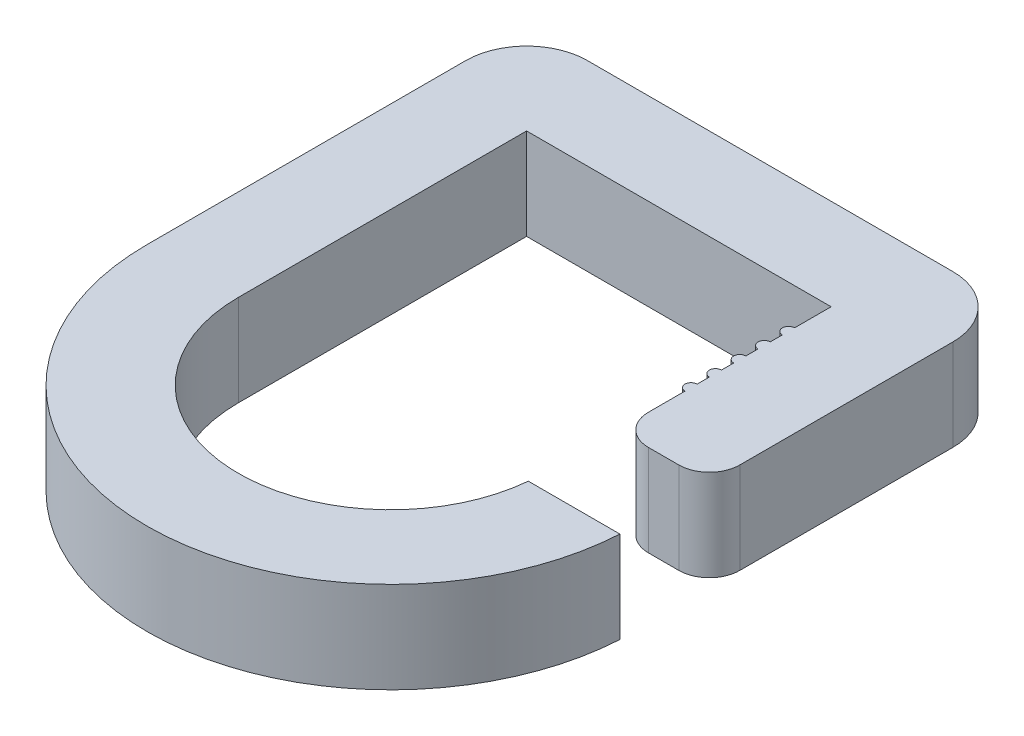
ISO-10303-21;
HEADER;
FILE_DESCRIPTION(('STEP AP214'),'2;1');
FILE_NAME('part.step','',(''),(''),'','','');
FILE_SCHEMA(('AUTOMOTIVE_DESIGN { 1 0 10303 214 1 1 1 1 }'));
ENDSEC;
DATA;
#1=APPLICATION_CONTEXT('core data for automotive mechanical design processes');
#2=APPLICATION_PROTOCOL_DEFINITION('international standard','automotive_design',2000,#1);
#3=PRODUCT_CONTEXT('',#1,'mechanical');
#4=PRODUCT('Part','Part','',(#3));
#5=PRODUCT_RELATED_PRODUCT_CATEGORY('part','',(#4));
#6=PRODUCT_DEFINITION_FORMATION('','',#4);
#7=PRODUCT_DEFINITION_CONTEXT('part definition',#1,'design');
#8=PRODUCT_DEFINITION('design','',#6,#7);
#9=PRODUCT_DEFINITION_SHAPE('','',#8);
#10=(LENGTH_UNIT() NAMED_UNIT(*) SI_UNIT(.MILLI.,.METRE.));
#11=(NAMED_UNIT(*) PLANE_ANGLE_UNIT() SI_UNIT($,.RADIAN.));
#12=(NAMED_UNIT(*) SI_UNIT($,.STERADIAN.) SOLID_ANGLE_UNIT());
#13=UNCERTAINTY_MEASURE_WITH_UNIT(LENGTH_MEASURE(1.E-05),#10,'distance_accuracy_value','');
#14=(GEOMETRIC_REPRESENTATION_CONTEXT(3) GLOBAL_UNCERTAINTY_ASSIGNED_CONTEXT((#13)) GLOBAL_UNIT_ASSIGNED_CONTEXT((#10,
#11,#12)) REPRESENTATION_CONTEXT('',''));
#15=CARTESIAN_POINT('',(0.,0.,0.));
#16=DIRECTION('',(0.,0.,1.));
#17=DIRECTION('',(1.,0.,0.));
#18=AXIS2_PLACEMENT_3D('',#15,#16,#17);
#19=CARTESIAN_POINT('',(65.,15.,0.));
#20=DIRECTION('',(1.,0.,0.));
#21=DIRECTION('',(0.,0.,-1.));
#22=AXIS2_PLACEMENT_3D('',#19,#20,#21);
#23=PLANE('',#22);
#24=DIRECTION('',(0.,0.,1.));
#25=VECTOR('',#24,1.);
#26=CARTESIAN_POINT('',(65.,0.,0.));
#27=LINE('',#26,#25);
#28=CARTESIAN_POINT('',(65.,0.,0.));
#29=VERTEX_POINT('',#28);
#30=CARTESIAN_POINT('',(65.,0.,6.00000000000001));
#31=VERTEX_POINT('',#30);
#32=EDGE_CURVE('E212',#29,#31,#27,.T.);
#33=ORIENTED_EDGE('',*,*,#32,.T.);
#34=DIRECTION('',(0.,1.,0.));
#35=VECTOR('',#34,1.);
#36=CARTESIAN_POINT('',(65.,-2.82842712474619,6.00000000000001));
#37=LINE('',#36,#35);
#38=CARTESIAN_POINT('',(65.,15.,6.00000000000001));
#39=VERTEX_POINT('',#38);
#40=EDGE_CURVE('E63',#31,#39,#37,.T.);
#41=ORIENTED_EDGE('',*,*,#40,.T.);
#42=DIRECTION('',(0.,0.,1.));
#43=VECTOR('',#42,1.);
#44=CARTESIAN_POINT('',(65.,15.,0.));
#45=LINE('',#44,#43);
#46=CARTESIAN_POINT('',(65.,15.,0.));
#47=VERTEX_POINT('',#46);
#48=EDGE_CURVE('E313',#47,#39,#45,.T.);
#49=ORIENTED_EDGE('',*,*,#48,.F.);
#50=DIRECTION('',(0.,-1.,0.));
#51=VECTOR('',#50,1.);
#52=CARTESIAN_POINT('',(65.,15.,0.));
#53=LINE('',#52,#51);
#54=EDGE_CURVE('E328',#47,#29,#53,.T.);
#55=ORIENTED_EDGE('',*,*,#54,.T.);
#56=EDGE_LOOP('',(#33,#41,#49,#55));
#57=FACE_BOUND('',#56,.T.);
#58=ADVANCED_FACE('F39',(#57),#23,.F.);
#59=CARTESIAN_POINT('',(65.,0.,16.));
#60=VERTEX_POINT('',#59);
#61=CARTESIAN_POINT('',(65.,0.,18.));
#62=VERTEX_POINT('',#61);
#63=EDGE_CURVE('E346',#60,#62,#27,.T.);
#64=ORIENTED_EDGE('',*,*,#63,.T.);
#65=DIRECTION('',(0.,1.,0.));
#66=VECTOR('',#65,1.);
#67=CARTESIAN_POINT('',(65.,-2.82842712474619,18.));
#68=LINE('',#67,#66);
#69=CARTESIAN_POINT('',(65.,15.,18.));
#70=VERTEX_POINT('',#69);
#71=EDGE_CURVE('E244',#62,#70,#68,.T.);
#72=ORIENTED_EDGE('',*,*,#71,.T.);
#73=CARTESIAN_POINT('',(65.,15.,16.));
#74=VERTEX_POINT('',#73);
#75=EDGE_CURVE('E317',#74,#70,#45,.T.);
#76=ORIENTED_EDGE('',*,*,#75,.F.);
#77=DIRECTION('',(0.,1.,0.));
#78=VECTOR('',#77,1.);
#79=CARTESIAN_POINT('',(65.,-2.82842712474619,16.));
#80=LINE('',#79,#78);
#81=EDGE_CURVE('E284',#74,#60,#80,.F.);
#82=ORIENTED_EDGE('',*,*,#81,.T.);
#83=EDGE_LOOP('',(#64,#72,#76,#82));
#84=FACE_BOUND('',#83,.T.);
#85=ADVANCED_FACE('F495',(#84),#23,.F.);
#86=CARTESIAN_POINT('',(65.,15.,20.));
#87=VERTEX_POINT('',#86);
#88=CARTESIAN_POINT('',(65.,15.,22.));
#89=VERTEX_POINT('',#88);
#90=EDGE_CURVE('E530',#87,#89,#45,.T.);
#91=ORIENTED_EDGE('',*,*,#90,.F.);
#92=DIRECTION('',(0.,1.,0.));
#93=VECTOR('',#92,1.);
#94=CARTESIAN_POINT('',(65.,-2.82842712474619,20.));
#95=LINE('',#94,#93);
#96=CARTESIAN_POINT('',(65.,0.,20.));
#97=VERTEX_POINT('',#96);
#98=EDGE_CURVE('E240',#87,#97,#95,.F.);
#99=ORIENTED_EDGE('',*,*,#98,.T.);
#100=CARTESIAN_POINT('',(65.,0.,22.));
#101=VERTEX_POINT('',#100);
#102=EDGE_CURVE('E215',#97,#101,#27,.T.);
#103=ORIENTED_EDGE('',*,*,#102,.T.);
#104=DIRECTION('',(0.,1.,0.));
#105=VECTOR('',#104,1.);
#106=CARTESIAN_POINT('',(65.,-2.82842712474619,22.));
#107=LINE('',#106,#105);
#108=EDGE_CURVE('E259',#101,#89,#107,.T.);
#109=ORIENTED_EDGE('',*,*,#108,.T.);
#110=EDGE_LOOP('',(#91,#99,#103,#109));
#111=FACE_BOUND('',#110,.T.);
#112=ADVANCED_FACE('F502',(#111),#23,.F.);
#113=CARTESIAN_POINT('',(65.,15.,8.00000000000001));
#114=VERTEX_POINT('',#113);
#115=CARTESIAN_POINT('',(65.,15.,10.));
#116=VERTEX_POINT('',#115);
#117=EDGE_CURVE('E55',#114,#116,#45,.T.);
#118=ORIENTED_EDGE('',*,*,#117,.F.);
#119=DIRECTION('',(0.,1.,0.));
#120=VECTOR('',#119,1.);
#121=CARTESIAN_POINT('',(65.,-2.82842712474619,8.00000000000001));
#122=LINE('',#121,#120);
#123=CARTESIAN_POINT('',(65.,0.,8.00000000000001));
#124=VERTEX_POINT('',#123);
#125=EDGE_CURVE('E216',#114,#124,#122,.F.);
#126=ORIENTED_EDGE('',*,*,#125,.T.);
#127=CARTESIAN_POINT('',(65.,0.,10.));
#128=VERTEX_POINT('',#127);
#129=EDGE_CURVE('E203',#124,#128,#27,.T.);
#130=ORIENTED_EDGE('',*,*,#129,.T.);
#131=DIRECTION('',(0.,1.,0.));
#132=VECTOR('',#131,1.);
#133=CARTESIAN_POINT('',(65.,-2.82842712474619,10.));
#134=LINE('',#133,#132);
#135=EDGE_CURVE('E273',#128,#116,#134,.T.);
#136=ORIENTED_EDGE('',*,*,#135,.T.);
#137=EDGE_LOOP('',(#118,#126,#130,#136));
#138=FACE_BOUND('',#137,.T.);
#139=ADVANCED_FACE('F217',(#138),#23,.F.);
#140=CARTESIAN_POINT('',(65.,15.,12.));
#141=VERTEX_POINT('',#140);
#142=CARTESIAN_POINT('',(65.,15.,14.));
#143=VERTEX_POINT('',#142);
#144=EDGE_CURVE('E521',#141,#143,#45,.T.);
#145=ORIENTED_EDGE('',*,*,#144,.F.);
#146=DIRECTION('',(0.,1.,0.));
#147=VECTOR('',#146,1.);
#148=CARTESIAN_POINT('',(65.,-2.82842712474619,12.));
#149=LINE('',#148,#147);
#150=CARTESIAN_POINT('',(65.,0.,12.));
#151=VERTEX_POINT('',#150);
#152=EDGE_CURVE('E269',#141,#151,#149,.F.);
#153=ORIENTED_EDGE('',*,*,#152,.T.);
#154=CARTESIAN_POINT('',(65.,0.,14.));
#155=VERTEX_POINT('',#154);
#156=EDGE_CURVE('E213',#151,#155,#27,.T.);
#157=ORIENTED_EDGE('',*,*,#156,.T.);
#158=DIRECTION('',(0.,1.,0.));
#159=VECTOR('',#158,1.);
#160=CARTESIAN_POINT('',(65.,-2.82842712474619,14.));
#161=LINE('',#160,#159);
#162=EDGE_CURVE('E288',#155,#143,#161,.T.);
#163=ORIENTED_EDGE('',*,*,#162,.T.);
#164=EDGE_LOOP('',(#145,#153,#157,#163));
#165=FACE_BOUND('',#164,.T.);
#166=ADVANCED_FACE('F508',(#165),#23,.F.);
#167=CARTESIAN_POINT('',(40.0232427774479,15.,47.3315251485228));
#168=DIRECTION('',(0.,-1.,0.));
#169=DIRECTION('',(0.,0.,-1.));
#170=AXIS2_PLACEMENT_3D('',#167,#168,#169);
#171=CYLINDRICAL_SURFACE('',#170,40.0232427774479);
#172=CARTESIAN_POINT('',(40.0232427774479,0.,47.3315251485228));
#173=DIRECTION('',(0.,1.,0.));
#174=DIRECTION('',(0.,0.,1.));
#175=AXIS2_PLACEMENT_3D('',#172,#173,#174);
#176=CIRCLE('',#175,40.0232427774479);
#177=CARTESIAN_POINT('',(0.,0.,47.3315251485228));
#178=VERTEX_POINT('',#177);
#179=CARTESIAN_POINT('',(79.9787197080692,0.,49.6595770528261));
#180=VERTEX_POINT('',#179);
#181=EDGE_CURVE('E292',#178,#180,#176,.T.);
#182=ORIENTED_EDGE('',*,*,#181,.T.);
#183=DIRECTION('',(0.,-1.,0.));
#184=VECTOR('',#183,1.);
#185=CARTESIAN_POINT('',(79.9787197080692,15.,49.6595770528261));
#186=LINE('',#185,#184);
#187=CARTESIAN_POINT('',(79.9787197080692,15.,49.6595770528261));
#188=VERTEX_POINT('',#187);
#189=EDGE_CURVE('E374',#188,#180,#186,.T.);
#190=ORIENTED_EDGE('',*,*,#189,.F.);
#191=CARTESIAN_POINT('',(40.0232427774479,15.,47.3315251485228));
#192=DIRECTION('',(0.,1.,0.));
#193=DIRECTION('',(0.,0.,1.));
#194=AXIS2_PLACEMENT_3D('',#191,#192,#193);
#195=CIRCLE('',#194,40.0232427774479);
#196=CARTESIAN_POINT('',(0.,15.,47.3315251485228));
#197=VERTEX_POINT('',#196);
#198=EDGE_CURVE('E296',#197,#188,#195,.T.);
#199=ORIENTED_EDGE('',*,*,#198,.F.);
#200=DIRECTION('',(0.,-1.,0.));
#201=VECTOR('',#200,1.);
#202=CARTESIAN_POINT('',(0.,15.,47.3315251485228));
#203=LINE('',#202,#201);
#204=EDGE_CURVE('E378',#197,#178,#203,.T.);
#205=ORIENTED_EDGE('',*,*,#204,.T.);
#206=EDGE_LOOP('',(#182,#190,#199,#205));
#207=FACE_BOUND('',#206,.T.);
#208=ADVANCED_FACE('F472',(#207),#171,.T.);
#209=CARTESIAN_POINT('',(64.9379543637772,15.,49.6595770528261));
#210=DIRECTION('',(0.,0.,1.));
#211=DIRECTION('',(1.,0.,0.));
#212=AXIS2_PLACEMENT_3D('',#209,#210,#211);
#213=PLANE('',#212);
#214=DIRECTION('',(-1.,0.,0.));
#215=VECTOR('',#214,1.);
#216=CARTESIAN_POINT('',(64.9379543637772,0.,49.6595770528261));
#217=LINE('',#216,#215);
#218=CARTESIAN_POINT('',(64.9379543637772,0.,49.6595770528261));
#219=VERTEX_POINT('',#218);
#220=EDGE_CURVE('E331',#180,#219,#217,.T.);
#221=ORIENTED_EDGE('',*,*,#220,.T.);
#222=DIRECTION('',(0.,-1.,0.));
#223=VECTOR('',#222,1.);
#224=CARTESIAN_POINT('',(64.9379543637772,15.,49.6595770528261));
#225=LINE('',#224,#223);
#226=CARTESIAN_POINT('',(64.9379543637772,15.,49.6595770528261));
#227=VERTEX_POINT('',#226);
#228=EDGE_CURVE('E370',#227,#219,#225,.T.);
#229=ORIENTED_EDGE('',*,*,#228,.F.);
#230=DIRECTION('',(-1.,0.,0.));
#231=VECTOR('',#230,1.);
#232=CARTESIAN_POINT('',(64.9379543637772,15.,49.6595770528261));
#233=LINE('',#232,#231);
#234=EDGE_CURVE('E300',#188,#227,#233,.T.);
#235=ORIENTED_EDGE('',*,*,#234,.F.);
#236=ORIENTED_EDGE('',*,*,#189,.T.);
#237=EDGE_LOOP('',(#221,#229,#235,#236));
#238=FACE_BOUND('',#237,.T.);
#239=ADVANCED_FACE('F479',(#238),#213,.F.);
#240=CARTESIAN_POINT('',(40.0232427774479,15.,47.3315251485228));
#241=DIRECTION('',(0.,-1.,0.));
#242=DIRECTION('',(0.,0.,-1.));
#243=AXIS2_PLACEMENT_3D('',#240,#241,#242);
#244=CYLINDRICAL_SURFACE('',#243,25.0232427774479);
#245=CARTESIAN_POINT('',(40.0232427774479,0.,47.3315251485228));
#246=DIRECTION('',(0.,-1.,0.));
#247=DIRECTION('',(0.,0.,1.));
#248=AXIS2_PLACEMENT_3D('',#245,#246,#247);
#249=CIRCLE('',#248,25.0232427774479);
#250=CARTESIAN_POINT('',(15.,0.,47.3315251485228));
#251=VERTEX_POINT('',#250);
#252=EDGE_CURVE('E334',#219,#251,#249,.T.);
#253=ORIENTED_EDGE('',*,*,#252,.T.);
#254=DIRECTION('',(0.,-1.,0.));
#255=VECTOR('',#254,1.);
#256=CARTESIAN_POINT('',(15.,15.,47.3315251485228));
#257=LINE('',#256,#255);
#258=CARTESIAN_POINT('',(15.,15.,47.3315251485228));
#259=VERTEX_POINT('',#258);
#260=EDGE_CURVE('E366',#259,#251,#257,.T.);
#261=ORIENTED_EDGE('',*,*,#260,.F.);
#262=CARTESIAN_POINT('',(40.0232427774479,15.,47.3315251485228));
#263=DIRECTION('',(0.,-1.,0.));
#264=DIRECTION('',(0.,0.,1.));
#265=AXIS2_PLACEMENT_3D('',#262,#263,#264);
#266=CIRCLE('',#265,25.0232427774479);
#267=EDGE_CURVE('E303',#227,#259,#266,.T.);
#268=ORIENTED_EDGE('',*,*,#267,.F.);
#269=ORIENTED_EDGE('',*,*,#228,.T.);
#270=EDGE_LOOP('',(#253,#261,#268,#269));
#271=FACE_BOUND('',#270,.T.);
#272=ADVANCED_FACE('F483',(#271),#244,.F.);
#273=CARTESIAN_POINT('',(15.,15.,0.));
#274=DIRECTION('',(-1.,0.,0.));
#275=DIRECTION('',(0.,0.,1.));
#276=AXIS2_PLACEMENT_3D('',#273,#274,#275);
#277=PLANE('',#276);
#278=DIRECTION('',(0.,0.,-1.));
#279=VECTOR('',#278,1.);
#280=CARTESIAN_POINT('',(15.,0.,0.));
#281=LINE('',#280,#279);
#282=CARTESIAN_POINT('',(15.,0.,0.));
#283=VERTEX_POINT('',#282);
#284=EDGE_CURVE('E337',#251,#283,#281,.T.);
#285=ORIENTED_EDGE('',*,*,#284,.T.);
#286=DIRECTION('',(0.,-1.,0.));
#287=VECTOR('',#286,1.);
#288=CARTESIAN_POINT('',(15.,15.,0.));
#289=LINE('',#288,#287);
#290=CARTESIAN_POINT('',(15.,15.,0.));
#291=VERTEX_POINT('',#290);
#292=EDGE_CURVE('E362',#291,#283,#289,.T.);
#293=ORIENTED_EDGE('',*,*,#292,.F.);
#294=DIRECTION('',(0.,0.,-1.));
#295=VECTOR('',#294,1.);
#296=CARTESIAN_POINT('',(15.,15.,0.));
#297=LINE('',#296,#295);
#298=EDGE_CURVE('E306',#259,#291,#297,.T.);
#299=ORIENTED_EDGE('',*,*,#298,.F.);
#300=ORIENTED_EDGE('',*,*,#260,.T.);
#301=EDGE_LOOP('',(#285,#293,#299,#300));
#302=FACE_BOUND('',#301,.T.);
#303=ADVANCED_FACE('F488',(#302),#277,.F.);
#304=CARTESIAN_POINT('',(15.,15.,0.));
#305=DIRECTION('',(0.,0.,-1.));
#306=DIRECTION('',(-1.,0.,0.));
#307=AXIS2_PLACEMENT_3D('',#304,#305,#306);
#308=PLANE('',#307);
#309=DIRECTION('',(1.,0.,0.));
#310=VECTOR('',#309,1.);
#311=CARTESIAN_POINT('',(15.,0.,0.));
#312=LINE('',#311,#310);
#313=EDGE_CURVE('E340',#283,#29,#312,.T.);
#314=ORIENTED_EDGE('',*,*,#313,.T.);
#315=ORIENTED_EDGE('',*,*,#54,.F.);
#316=DIRECTION('',(1.,0.,0.));
#317=VECTOR('',#316,1.);
#318=CARTESIAN_POINT('',(15.,15.,0.));
#319=LINE('',#318,#317);
#320=EDGE_CURVE('E309',#291,#47,#319,.T.);
#321=ORIENTED_EDGE('',*,*,#320,.F.);
#322=ORIENTED_EDGE('',*,*,#292,.T.);
#323=EDGE_LOOP('',(#314,#315,#321,#322));
#324=FACE_BOUND('',#323,.T.);
#325=ADVANCED_FACE('F492',(#324),#308,.F.);
#326=CARTESIAN_POINT('',(65.,15.,24.));
#327=VERTEX_POINT('',#326);
#328=CARTESIAN_POINT('',(65.,15.,30.));
#329=VERTEX_POINT('',#328);
#330=EDGE_CURVE('E312',#327,#329,#45,.T.);
#331=ORIENTED_EDGE('',*,*,#330,.F.);
#332=DIRECTION('',(0.,1.,0.));
#333=VECTOR('',#332,1.);
#334=CARTESIAN_POINT('',(65.,-2.82842712474619,24.));
#335=LINE('',#334,#333);
#336=CARTESIAN_POINT('',(65.,0.,24.));
#337=VERTEX_POINT('',#336);
#338=EDGE_CURVE('E255',#327,#337,#335,.F.);
#339=ORIENTED_EDGE('',*,*,#338,.T.);
#340=CARTESIAN_POINT('',(65.,0.,30.));
#341=VERTEX_POINT('',#340);
#342=EDGE_CURVE('E342',#337,#341,#27,.T.);
#343=ORIENTED_EDGE('',*,*,#342,.T.);
#344=DIRECTION('',(0.,-1.,0.));
#345=VECTOR('',#344,1.);
#346=CARTESIAN_POINT('',(65.,15.,30.));
#347=LINE('',#346,#345);
#348=EDGE_CURVE('E424',#341,#329,#347,.F.);
#349=ORIENTED_EDGE('',*,*,#348,.T.);
#350=EDGE_LOOP('',(#331,#339,#343,#349));
#351=FACE_BOUND('',#350,.T.);
#352=ADVANCED_FACE('F497',(#351),#23,.F.);
#353=CARTESIAN_POINT('',(65.,15.,35.));
#354=DIRECTION('',(0.,0.,-1.));
#355=DIRECTION('',(-1.,0.,0.));
#356=AXIS2_PLACEMENT_3D('',#353,#354,#355);
#357=PLANE('',#356);
#358=DIRECTION('',(1.,0.,0.));
#359=VECTOR('',#358,1.);
#360=CARTESIAN_POINT('',(65.,15.,35.));
#361=LINE('',#360,#359);
#362=CARTESIAN_POINT('',(70.,15.,35.));
#363=VERTEX_POINT('',#362);
#364=CARTESIAN_POINT('',(75.,15.,35.));
#365=VERTEX_POINT('',#364);
#366=EDGE_CURVE('E316',#363,#365,#361,.T.);
#367=ORIENTED_EDGE('',*,*,#366,.F.);
#368=DIRECTION('',(0.,-1.,0.));
#369=VECTOR('',#368,1.);
#370=CARTESIAN_POINT('',(70.,15.,35.));
#371=LINE('',#370,#369);
#372=CARTESIAN_POINT('',(70.,0.,35.));
#373=VERTEX_POINT('',#372);
#374=EDGE_CURVE('E413',#363,#373,#371,.T.);
#375=ORIENTED_EDGE('',*,*,#374,.T.);
#376=DIRECTION('',(1.,0.,0.));
#377=VECTOR('',#376,1.);
#378=CARTESIAN_POINT('',(65.,0.,35.));
#379=LINE('',#378,#377);
#380=CARTESIAN_POINT('',(75.,0.,35.));
#381=VERTEX_POINT('',#380);
#382=EDGE_CURVE('E345',#373,#381,#379,.T.);
#383=ORIENTED_EDGE('',*,*,#382,.T.);
#384=DIRECTION('',(0.,-1.,0.));
#385=VECTOR('',#384,1.);
#386=CARTESIAN_POINT('',(75.,15.,35.));
#387=LINE('',#386,#385);
#388=EDGE_CURVE('E410',#381,#365,#387,.F.);
#389=ORIENTED_EDGE('',*,*,#388,.T.);
#390=EDGE_LOOP('',(#367,#375,#383,#389));
#391=FACE_BOUND('',#390,.T.);
#392=ADVANCED_FACE('F440',(#391),#357,.F.);
#393=CARTESIAN_POINT('',(80.,15.,0.));
#394=DIRECTION('',(-1.,0.,0.));
#395=DIRECTION('',(0.,0.,1.));
#396=AXIS2_PLACEMENT_3D('',#393,#394,#395);
#397=PLANE('',#396);
#398=DIRECTION('',(0.,0.,-1.));
#399=VECTOR('',#398,1.);
#400=CARTESIAN_POINT('',(80.,15.,0.));
#401=LINE('',#400,#399);
#402=CARTESIAN_POINT('',(80.,15.,30.));
#403=VERTEX_POINT('',#402);
#404=CARTESIAN_POINT('',(80.,15.,-5.));
#405=VERTEX_POINT('',#404);
#406=EDGE_CURVE('E321',#403,#405,#401,.T.);
#407=ORIENTED_EDGE('',*,*,#406,.F.);
#408=DIRECTION('',(0.,-1.,0.));
#409=VECTOR('',#408,1.);
#410=CARTESIAN_POINT('',(80.,15.,30.));
#411=LINE('',#410,#409);
#412=CARTESIAN_POINT('',(80.,0.,30.));
#413=VERTEX_POINT('',#412);
#414=EDGE_CURVE('E11',#403,#413,#411,.T.);
#415=ORIENTED_EDGE('',*,*,#414,.T.);
#416=DIRECTION('',(0.,0.,-1.));
#417=VECTOR('',#416,1.);
#418=CARTESIAN_POINT('',(80.,0.,0.));
#419=LINE('',#418,#417);
#420=CARTESIAN_POINT('',(80.,0.,-5.));
#421=VERTEX_POINT('',#420);
#422=EDGE_CURVE('E350',#413,#421,#419,.T.);
#423=ORIENTED_EDGE('',*,*,#422,.T.);
#424=DIRECTION('',(0.,-1.,0.));
#425=VECTOR('',#424,1.);
#426=CARTESIAN_POINT('',(80.,15.,-5.));
#427=LINE('',#426,#425);
#428=EDGE_CURVE('E396',#421,#405,#427,.F.);
#429=ORIENTED_EDGE('',*,*,#428,.T.);
#430=EDGE_LOOP('',(#407,#415,#423,#429));
#431=FACE_BOUND('',#430,.T.);
#432=ADVANCED_FACE('F449',(#431),#397,.F.);
#433=CARTESIAN_POINT('',(0.,15.,-15.));
#434=DIRECTION('',(0.,0.,1.));
#435=DIRECTION('',(1.,0.,0.));
#436=AXIS2_PLACEMENT_3D('',#433,#434,#435);
#437=PLANE('',#436);
#438=DIRECTION('',(-1.,0.,0.));
#439=VECTOR('',#438,1.);
#440=CARTESIAN_POINT('',(0.,15.,-15.));
#441=LINE('',#440,#439);
#442=CARTESIAN_POINT('',(70.,15.,-15.));
#443=VERTEX_POINT('',#442);
#444=CARTESIAN_POINT('',(10.,15.,-15.));
#445=VERTEX_POINT('',#444);
#446=EDGE_CURVE('E324',#443,#445,#441,.T.);
#447=ORIENTED_EDGE('',*,*,#446,.F.);
#448=DIRECTION('',(0.,-1.,0.));
#449=VECTOR('',#448,1.);
#450=CARTESIAN_POINT('',(70.,15.,-15.));
#451=LINE('',#450,#449);
#452=CARTESIAN_POINT('',(70.,0.,-15.));
#453=VERTEX_POINT('',#452);
#454=EDGE_CURVE('E385',#443,#453,#451,.T.);
#455=ORIENTED_EDGE('',*,*,#454,.T.);
#456=DIRECTION('',(-1.,0.,0.));
#457=VECTOR('',#456,1.);
#458=CARTESIAN_POINT('',(0.,0.,-15.));
#459=LINE('',#458,#457);
#460=CARTESIAN_POINT('',(10.,0.,-15.));
#461=VERTEX_POINT('',#460);
#462=EDGE_CURVE('E353',#453,#461,#459,.T.);
#463=ORIENTED_EDGE('',*,*,#462,.T.);
#464=DIRECTION('',(0.,-1.,0.));
#465=VECTOR('',#464,1.);
#466=CARTESIAN_POINT('',(10.,15.,-15.));
#467=LINE('',#466,#465);
#468=EDGE_CURVE('E382',#461,#445,#467,.F.);
#469=ORIENTED_EDGE('',*,*,#468,.T.);
#470=EDGE_LOOP('',(#447,#455,#463,#469));
#471=FACE_BOUND('',#470,.T.);
#472=ADVANCED_FACE('F458',(#471),#437,.F.);
#473=CARTESIAN_POINT('',(0.,15.,0.));
#474=DIRECTION('',(1.,0.,0.));
#475=DIRECTION('',(0.,0.,-1.));
#476=AXIS2_PLACEMENT_3D('',#473,#474,#475);
#477=PLANE('',#476);
#478=DIRECTION('',(0.,0.,1.));
#479=VECTOR('',#478,1.);
#480=CARTESIAN_POINT('',(0.,15.,0.));
#481=LINE('',#480,#479);
#482=CARTESIAN_POINT('',(0.,15.,-5.));
#483=VERTEX_POINT('',#482);
#484=EDGE_CURVE('E293',#483,#197,#481,.T.);
#485=ORIENTED_EDGE('',*,*,#484,.F.);
#486=DIRECTION('',(0.,-1.,0.));
#487=VECTOR('',#486,1.);
#488=CARTESIAN_POINT('',(0.,15.,-5.));
#489=LINE('',#488,#487);
#490=CARTESIAN_POINT('',(0.,0.,-5.));
#491=VERTEX_POINT('',#490);
#492=EDGE_CURVE('E406',#483,#491,#489,.T.);
#493=ORIENTED_EDGE('',*,*,#492,.T.);
#494=DIRECTION('',(0.,0.,1.));
#495=VECTOR('',#494,1.);
#496=CARTESIAN_POINT('',(0.,0.,0.));
#497=LINE('',#496,#495);
#498=EDGE_CURVE('E297',#491,#178,#497,.T.);
#499=ORIENTED_EDGE('',*,*,#498,.T.);
#500=ORIENTED_EDGE('',*,*,#204,.F.);
#501=EDGE_LOOP('',(#485,#493,#499,#500));
#502=FACE_BOUND('',#501,.T.);
#503=ADVANCED_FACE('F468',(#502),#477,.F.);
#504=CARTESIAN_POINT('',(40.0232427774479,15.,47.3315251485228));
#505=DIRECTION('',(0.,1.,0.));
#506=DIRECTION('',(0.,0.,1.));
#507=AXIS2_PLACEMENT_3D('',#504,#505,#506);
#508=PLANE('',#507);
#509=ORIENTED_EDGE('',*,*,#48,.T.);
#510=CARTESIAN_POINT('',(65.,15.,7.00000000000001));
#511=DIRECTION('',(0.,1.,0.));
#512=DIRECTION('',(0.,0.,1.));
#513=AXIS2_PLACEMENT_3D('',#510,#511,#512);
#514=CIRCLE('',#513,0.999999999999998);
#515=EDGE_CURVE('E225',#39,#114,#514,.T.);
#516=ORIENTED_EDGE('',*,*,#515,.T.);
#517=ORIENTED_EDGE('',*,*,#117,.T.);
#518=CARTESIAN_POINT('',(65.,15.,11.));
#519=DIRECTION('',(0.,1.,0.));
#520=DIRECTION('',(0.,0.,1.));
#521=AXIS2_PLACEMENT_3D('',#518,#519,#520);
#522=CIRCLE('',#521,0.999999999999998);
#523=EDGE_CURVE('E263',#116,#141,#522,.T.);
#524=ORIENTED_EDGE('',*,*,#523,.T.);
#525=ORIENTED_EDGE('',*,*,#144,.T.);
#526=CARTESIAN_POINT('',(65.,15.,15.));
#527=DIRECTION('',(0.,1.,0.));
#528=DIRECTION('',(0.,0.,1.));
#529=AXIS2_PLACEMENT_3D('',#526,#527,#528);
#530=CIRCLE('',#529,0.999999999999998);
#531=EDGE_CURVE('E276',#143,#74,#530,.T.);
#532=ORIENTED_EDGE('',*,*,#531,.T.);
#533=ORIENTED_EDGE('',*,*,#75,.T.);
#534=CARTESIAN_POINT('',(65.,15.,19.));
#535=DIRECTION('',(0.,1.,0.));
#536=DIRECTION('',(0.,0.,1.));
#537=AXIS2_PLACEMENT_3D('',#534,#535,#536);
#538=CIRCLE('',#537,0.999999999999998);
#539=EDGE_CURVE('E232',#70,#87,#538,.T.);
#540=ORIENTED_EDGE('',*,*,#539,.T.);
#541=ORIENTED_EDGE('',*,*,#90,.T.);
#542=CARTESIAN_POINT('',(65.,15.,23.));
#543=DIRECTION('',(0.,1.,0.));
#544=DIRECTION('',(0.,0.,1.));
#545=AXIS2_PLACEMENT_3D('',#542,#543,#544);
#546=CIRCLE('',#545,0.999999999999998);
#547=EDGE_CURVE('E247',#89,#327,#546,.T.);
#548=ORIENTED_EDGE('',*,*,#547,.T.);
#549=ORIENTED_EDGE('',*,*,#330,.T.);
#550=CARTESIAN_POINT('',(70.,15.,30.));
#551=DIRECTION('',(0.,1.,0.));
#552=DIRECTION('',(0.,0.,1.));
#553=AXIS2_PLACEMENT_3D('',#550,#551,#552);
#554=CIRCLE('',#553,5.);
#555=EDGE_CURVE('E48',#329,#363,#554,.T.);
#556=ORIENTED_EDGE('',*,*,#555,.T.);
#557=ORIENTED_EDGE('',*,*,#366,.T.);
#558=CARTESIAN_POINT('',(75.,15.,30.));
#559=DIRECTION('',(0.,1.,0.));
#560=DIRECTION('',(0.,0.,1.));
#561=AXIS2_PLACEMENT_3D('',#558,#559,#560);
#562=CIRCLE('',#561,5.);
#563=EDGE_CURVE('E428',#365,#403,#562,.T.);
#564=ORIENTED_EDGE('',*,*,#563,.T.);
#565=ORIENTED_EDGE('',*,*,#406,.T.);
#566=CARTESIAN_POINT('',(70.,15.,-5.));
#567=DIRECTION('',(0.,1.,0.));
#568=DIRECTION('',(0.,0.,1.));
#569=AXIS2_PLACEMENT_3D('',#566,#567,#568);
#570=CIRCLE('',#569,10.);
#571=EDGE_CURVE('E403',#405,#443,#570,.T.);
#572=ORIENTED_EDGE('',*,*,#571,.T.);
#573=ORIENTED_EDGE('',*,*,#446,.T.);
#574=CARTESIAN_POINT('',(10.,15.,-5.));
#575=DIRECTION('',(0.,1.,0.));
#576=DIRECTION('',(0.,0.,1.));
#577=AXIS2_PLACEMENT_3D('',#574,#575,#576);
#578=CIRCLE('',#577,10.);
#579=EDGE_CURVE('E400',#445,#483,#578,.T.);
#580=ORIENTED_EDGE('',*,*,#579,.T.);
#581=ORIENTED_EDGE('',*,*,#484,.T.);
#582=ORIENTED_EDGE('',*,*,#198,.T.);
#583=ORIENTED_EDGE('',*,*,#234,.T.);
#584=ORIENTED_EDGE('',*,*,#267,.T.);
#585=ORIENTED_EDGE('',*,*,#298,.T.);
#586=ORIENTED_EDGE('',*,*,#320,.T.);
#587=EDGE_LOOP('',(#509,#516,#517,#524,#525,#532,#533,#540,#541,#548,#549,#556,#557,#564,#565,
#572,#573,#580,#581,#582,#583,#584,#585,#586));
#588=FACE_BOUND('',#587,.T.);
#589=ADVANCED_FACE('F434',(#588),#508,.T.);
#590=CARTESIAN_POINT('',(40.0232427774479,0.,47.3315251485228));
#591=DIRECTION('',(0.,1.,0.));
#592=DIRECTION('',(0.,0.,1.));
#593=AXIS2_PLACEMENT_3D('',#590,#591,#592);
#594=PLANE('',#593);
#595=ORIENTED_EDGE('',*,*,#129,.F.);
#596=CARTESIAN_POINT('',(65.,0.,7.00000000000001));
#597=DIRECTION('',(0.,1.,0.));
#598=DIRECTION('',(0.,0.,1.));
#599=AXIS2_PLACEMENT_3D('',#596,#597,#598);
#600=CIRCLE('',#599,0.999999999999998);
#601=EDGE_CURVE('E207',#124,#31,#600,.F.);
#602=ORIENTED_EDGE('',*,*,#601,.T.);
#603=ORIENTED_EDGE('',*,*,#32,.F.);
#604=ORIENTED_EDGE('',*,*,#313,.F.);
#605=ORIENTED_EDGE('',*,*,#284,.F.);
#606=ORIENTED_EDGE('',*,*,#252,.F.);
#607=ORIENTED_EDGE('',*,*,#220,.F.);
#608=ORIENTED_EDGE('',*,*,#181,.F.);
#609=ORIENTED_EDGE('',*,*,#498,.F.);
#610=CARTESIAN_POINT('',(10.,0.,-5.));
#611=DIRECTION('',(0.,1.,0.));
#612=DIRECTION('',(0.,0.,1.));
#613=AXIS2_PLACEMENT_3D('',#610,#611,#612);
#614=CIRCLE('',#613,10.);
#615=EDGE_CURVE('E389',#491,#461,#614,.F.);
#616=ORIENTED_EDGE('',*,*,#615,.T.);
#617=ORIENTED_EDGE('',*,*,#462,.F.);
#618=CARTESIAN_POINT('',(70.,0.,-5.));
#619=DIRECTION('',(0.,1.,0.));
#620=DIRECTION('',(0.,0.,1.));
#621=AXIS2_PLACEMENT_3D('',#618,#619,#620);
#622=CIRCLE('',#621,10.);
#623=EDGE_CURVE('E392',#453,#421,#622,.F.);
#624=ORIENTED_EDGE('',*,*,#623,.T.);
#625=ORIENTED_EDGE('',*,*,#422,.F.);
#626=CARTESIAN_POINT('',(75.,0.,30.));
#627=DIRECTION('',(0.,1.,0.));
#628=DIRECTION('',(0.,0.,1.));
#629=AXIS2_PLACEMENT_3D('',#626,#627,#628);
#630=CIRCLE('',#629,5.);
#631=EDGE_CURVE('E417',#413,#381,#630,.F.);
#632=ORIENTED_EDGE('',*,*,#631,.T.);
#633=ORIENTED_EDGE('',*,*,#382,.F.);
#634=CARTESIAN_POINT('',(70.,0.,30.));
#635=DIRECTION('',(0.,1.,0.));
#636=DIRECTION('',(0.,0.,1.));
#637=AXIS2_PLACEMENT_3D('',#634,#635,#636);
#638=CIRCLE('',#637,5.);
#639=EDGE_CURVE('E420',#373,#341,#638,.F.);
#640=ORIENTED_EDGE('',*,*,#639,.T.);
#641=ORIENTED_EDGE('',*,*,#342,.F.);
#642=CARTESIAN_POINT('',(65.,0.,23.));
#643=DIRECTION('',(0.,1.,0.));
#644=DIRECTION('',(0.,0.,1.));
#645=AXIS2_PLACEMENT_3D('',#642,#643,#644);
#646=CIRCLE('',#645,0.999999999999998);
#647=EDGE_CURVE('E251',#337,#101,#646,.F.);
#648=ORIENTED_EDGE('',*,*,#647,.T.);
#649=ORIENTED_EDGE('',*,*,#102,.F.);
#650=CARTESIAN_POINT('',(65.,0.,19.));
#651=DIRECTION('',(0.,1.,0.));
#652=DIRECTION('',(0.,0.,1.));
#653=AXIS2_PLACEMENT_3D('',#650,#651,#652);
#654=CIRCLE('',#653,0.999999999999998);
#655=EDGE_CURVE('E236',#97,#62,#654,.F.);
#656=ORIENTED_EDGE('',*,*,#655,.T.);
#657=ORIENTED_EDGE('',*,*,#63,.F.);
#658=CARTESIAN_POINT('',(65.,0.,15.));
#659=DIRECTION('',(0.,1.,0.));
#660=DIRECTION('',(0.,0.,1.));
#661=AXIS2_PLACEMENT_3D('',#658,#659,#660);
#662=CIRCLE('',#661,0.999999999999998);
#663=EDGE_CURVE('E280',#60,#155,#662,.F.);
#664=ORIENTED_EDGE('',*,*,#663,.T.);
#665=ORIENTED_EDGE('',*,*,#156,.F.);
#666=CARTESIAN_POINT('',(65.,0.,11.));
#667=DIRECTION('',(0.,1.,0.));
#668=DIRECTION('',(0.,0.,1.));
#669=AXIS2_PLACEMENT_3D('',#666,#667,#668);
#670=CIRCLE('',#669,0.999999999999998);
#671=EDGE_CURVE('E209',#151,#128,#670,.F.);
#672=ORIENTED_EDGE('',*,*,#671,.T.);
#673=EDGE_LOOP('',(#595,#602,#603,#604,#605,#606,#607,#608,#609,#616,#617,#624,#625,#632,#633,
#640,#641,#648,#649,#656,#657,#664,#665,#672));
#674=FACE_BOUND('',#673,.T.);
#675=ADVANCED_FACE('F204',(#674),#594,.F.);
#676=CARTESIAN_POINT('',(70.,15.,-5.));
#677=DIRECTION('',(0.,-1.,0.));
#678=DIRECTION('',(0.,0.,-1.));
#679=AXIS2_PLACEMENT_3D('',#676,#677,#678);
#680=CYLINDRICAL_SURFACE('',#679,10.);
#681=ORIENTED_EDGE('',*,*,#571,.F.);
#682=ORIENTED_EDGE('',*,*,#428,.F.);
#683=ORIENTED_EDGE('',*,*,#623,.F.);
#684=ORIENTED_EDGE('',*,*,#454,.F.);
#685=EDGE_LOOP('',(#681,#682,#683,#684));
#686=FACE_BOUND('',#685,.T.);
#687=ADVANCED_FACE('F454',(#686),#680,.T.);
#688=CARTESIAN_POINT('',(10.,15.,-5.));
#689=DIRECTION('',(0.,-1.,0.));
#690=DIRECTION('',(0.,0.,-1.));
#691=AXIS2_PLACEMENT_3D('',#688,#689,#690);
#692=CYLINDRICAL_SURFACE('',#691,10.);
#693=ORIENTED_EDGE('',*,*,#579,.F.);
#694=ORIENTED_EDGE('',*,*,#468,.F.);
#695=ORIENTED_EDGE('',*,*,#615,.F.);
#696=ORIENTED_EDGE('',*,*,#492,.F.);
#697=EDGE_LOOP('',(#693,#694,#695,#696));
#698=FACE_BOUND('',#697,.T.);
#699=ADVANCED_FACE('F462',(#698),#692,.T.);
#700=CARTESIAN_POINT('',(70.,15.,30.));
#701=DIRECTION('',(0.,-1.,0.));
#702=DIRECTION('',(0.,0.,-1.));
#703=AXIS2_PLACEMENT_3D('',#700,#701,#702);
#704=CYLINDRICAL_SURFACE('',#703,5.);
#705=ORIENTED_EDGE('',*,*,#555,.F.);
#706=ORIENTED_EDGE('',*,*,#348,.F.);
#707=ORIENTED_EDGE('',*,*,#639,.F.);
#708=ORIENTED_EDGE('',*,*,#374,.F.);
#709=EDGE_LOOP('',(#705,#706,#707,#708));
#710=FACE_BOUND('',#709,.T.);
#711=ADVANCED_FACE('F443',(#710),#704,.T.);
#712=CARTESIAN_POINT('',(75.,15.,30.));
#713=DIRECTION('',(0.,-1.,0.));
#714=DIRECTION('',(0.,0.,-1.));
#715=AXIS2_PLACEMENT_3D('',#712,#713,#714);
#716=CYLINDRICAL_SURFACE('',#715,5.);
#717=ORIENTED_EDGE('',*,*,#563,.F.);
#718=ORIENTED_EDGE('',*,*,#388,.F.);
#719=ORIENTED_EDGE('',*,*,#631,.F.);
#720=ORIENTED_EDGE('',*,*,#414,.F.);
#721=EDGE_LOOP('',(#717,#718,#719,#720));
#722=FACE_BOUND('',#721,.T.);
#723=ADVANCED_FACE('F41',(#722),#716,.T.);
#724=CARTESIAN_POINT('',(65.,-2.82842712474619,15.));
#725=DIRECTION('',(0.,1.,0.));
#726=DIRECTION('',(0.,0.,1.));
#727=AXIS2_PLACEMENT_3D('',#724,#725,#726);
#728=CYLINDRICAL_SURFACE('',#727,0.999999999999998);
#729=ORIENTED_EDGE('',*,*,#162,.F.);
#730=ORIENTED_EDGE('',*,*,#663,.F.);
#731=ORIENTED_EDGE('',*,*,#81,.F.);
#732=ORIENTED_EDGE('',*,*,#531,.F.);
#733=EDGE_LOOP('',(#729,#730,#731,#732));
#734=FACE_BOUND('',#733,.T.);
#735=ADVANCED_FACE('F554',(#734),#728,.T.);
#736=CARTESIAN_POINT('',(65.,-2.82842712474619,11.));
#737=DIRECTION('',(0.,1.,0.));
#738=DIRECTION('',(0.,0.,1.));
#739=AXIS2_PLACEMENT_3D('',#736,#737,#738);
#740=CYLINDRICAL_SURFACE('',#739,0.999999999999998);
#741=ORIENTED_EDGE('',*,*,#135,.F.);
#742=ORIENTED_EDGE('',*,*,#671,.F.);
#743=ORIENTED_EDGE('',*,*,#152,.F.);
#744=ORIENTED_EDGE('',*,*,#523,.F.);
#745=EDGE_LOOP('',(#741,#742,#743,#744));
#746=FACE_BOUND('',#745,.T.);
#747=ADVANCED_FACE('F528',(#746),#740,.T.);
#748=CARTESIAN_POINT('',(65.,-2.82842712474619,23.));
#749=DIRECTION('',(0.,1.,0.));
#750=DIRECTION('',(0.,0.,1.));
#751=AXIS2_PLACEMENT_3D('',#748,#749,#750);
#752=CYLINDRICAL_SURFACE('',#751,0.999999999999998);
#753=ORIENTED_EDGE('',*,*,#108,.F.);
#754=ORIENTED_EDGE('',*,*,#647,.F.);
#755=ORIENTED_EDGE('',*,*,#338,.F.);
#756=ORIENTED_EDGE('',*,*,#547,.F.);
#757=EDGE_LOOP('',(#753,#754,#755,#756));
#758=FACE_BOUND('',#757,.T.);
#759=ADVANCED_FACE('F544',(#758),#752,.T.);
#760=CARTESIAN_POINT('',(65.,-2.82842712474619,19.));
#761=DIRECTION('',(0.,1.,0.));
#762=DIRECTION('',(0.,0.,1.));
#763=AXIS2_PLACEMENT_3D('',#760,#761,#762);
#764=CYLINDRICAL_SURFACE('',#763,0.999999999999998);
#765=ORIENTED_EDGE('',*,*,#71,.F.);
#766=ORIENTED_EDGE('',*,*,#655,.F.);
#767=ORIENTED_EDGE('',*,*,#98,.F.);
#768=ORIENTED_EDGE('',*,*,#539,.F.);
#769=EDGE_LOOP('',(#765,#766,#767,#768));
#770=FACE_BOUND('',#769,.T.);
#771=ADVANCED_FACE('F551',(#770),#764,.T.);
#772=CARTESIAN_POINT('',(65.,-2.82842712474619,7.00000000000001));
#773=DIRECTION('',(0.,1.,0.));
#774=DIRECTION('',(0.,0.,1.));
#775=AXIS2_PLACEMENT_3D('',#772,#773,#774);
#776=CYLINDRICAL_SURFACE('',#775,0.999999999999998);
#777=ORIENTED_EDGE('',*,*,#40,.F.);
#778=ORIENTED_EDGE('',*,*,#601,.F.);
#779=ORIENTED_EDGE('',*,*,#125,.F.);
#780=ORIENTED_EDGE('',*,*,#515,.F.);
#781=EDGE_LOOP('',(#777,#778,#779,#780));
#782=FACE_BOUND('',#781,.T.);
#783=ADVANCED_FACE('F223',(#782),#776,.T.);
#784=CLOSED_SHELL('',(#58,#85,#112,#139,#166,#208,#239,#272,#303,#325,#352,#392,#432,#472,#503,
#589,#675,#687,#699,#711,#723,#735,#747,#759,#771,#783));
#785=MANIFOLD_SOLID_BREP('B2',#784);
#786=ADVANCED_BREP_SHAPE_REPRESENTATION('',(#18,#785),#14);
#787=SHAPE_DEFINITION_REPRESENTATION(#9,#786);
ENDSEC;
END-ISO-10303-21;
